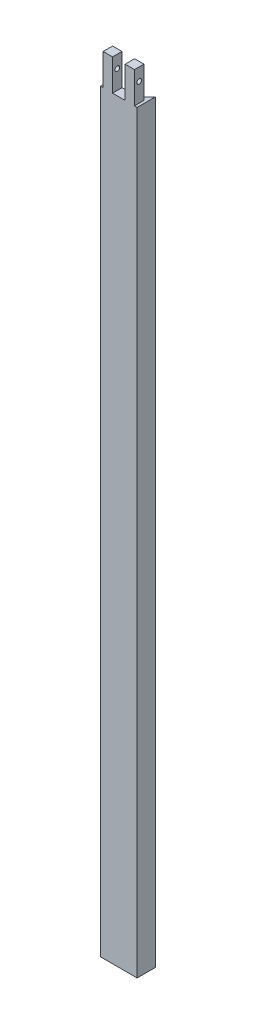
ISO-10303-21;
HEADER;
FILE_DESCRIPTION(('STEP AP214'),'2;1');
FILE_NAME('part.step','',(''),(''),'','','');
FILE_SCHEMA(('AUTOMOTIVE_DESIGN { 1 0 10303 214 1 1 1 1 }'));
ENDSEC;
DATA;
#1=APPLICATION_CONTEXT('core data for automotive mechanical design processes');
#2=APPLICATION_PROTOCOL_DEFINITION('international standard','automotive_design',2000,#1);
#3=PRODUCT_CONTEXT('',#1,'mechanical');
#4=PRODUCT('Part','Part','',(#3));
#5=PRODUCT_RELATED_PRODUCT_CATEGORY('part','',(#4));
#6=PRODUCT_DEFINITION_FORMATION('','',#4);
#7=PRODUCT_DEFINITION_CONTEXT('part definition',#1,'design');
#8=PRODUCT_DEFINITION('design','',#6,#7);
#9=PRODUCT_DEFINITION_SHAPE('','',#8);
#10=(LENGTH_UNIT() NAMED_UNIT(*) SI_UNIT(.MILLI.,.METRE.));
#11=(NAMED_UNIT(*) PLANE_ANGLE_UNIT() SI_UNIT($,.RADIAN.));
#12=(NAMED_UNIT(*) SI_UNIT($,.STERADIAN.) SOLID_ANGLE_UNIT());
#13=UNCERTAINTY_MEASURE_WITH_UNIT(LENGTH_MEASURE(1.E-05),#10,'distance_accuracy_value','');
#14=(GEOMETRIC_REPRESENTATION_CONTEXT(3) GLOBAL_UNCERTAINTY_ASSIGNED_CONTEXT((#13)) GLOBAL_UNIT_ASSIGNED_CONTEXT((#10,
#11,#12)) REPRESENTATION_CONTEXT('',''));
#15=CARTESIAN_POINT('',(0.,0.,0.));
#16=DIRECTION('',(0.,0.,1.));
#17=DIRECTION('',(1.,0.,0.));
#18=AXIS2_PLACEMENT_3D('',#15,#16,#17);
#19=CARTESIAN_POINT('',(0.,0.,3.));
#20=DIRECTION('',(0.,-1.,0.));
#21=DIRECTION('',(1.,0.,0.));
#22=AXIS2_PLACEMENT_3D('',#19,#20,#21);
#23=PLANE('',#22);
#24=DIRECTION('',(0.,0.,-1.));
#25=VECTOR('',#24,1.);
#26=CARTESIAN_POINT('',(2.00000000000002,0.,3.));
#27=LINE('',#26,#25);
#28=CARTESIAN_POINT('',(2.00000000000002,0.,3.));
#29=VERTEX_POINT('',#28);
#30=CARTESIAN_POINT('',(2.00000000000002,0.,0.));
#31=VERTEX_POINT('',#30);
#32=EDGE_CURVE('E168',#29,#31,#27,.T.);
#33=ORIENTED_EDGE('',*,*,#32,.F.);
#34=DIRECTION('',(-1.,0.,0.));
#35=VECTOR('',#34,1.);
#36=CARTESIAN_POINT('',(0.,0.,3.));
#37=LINE('',#36,#35);
#38=CARTESIAN_POINT('',(2.82842712474618,0.,3.));
#39=VERTEX_POINT('',#38);
#40=EDGE_CURVE('E260',#39,#29,#37,.T.);
#41=ORIENTED_EDGE('',*,*,#40,.F.);
#42=DIRECTION('',(0.,0.,1.));
#43=VECTOR('',#42,1.);
#44=CARTESIAN_POINT('',(2.82842712474619,0.,-2.82842712474619));
#45=LINE('',#44,#43);
#46=CARTESIAN_POINT('',(2.82842712474619,0.,-2.82842712474619));
#47=VERTEX_POINT('',#46);
#48=EDGE_CURVE('E241',#47,#39,#45,.T.);
#49=ORIENTED_EDGE('',*,*,#48,.F.);
#50=DIRECTION('',(0.707106781186546,0.,-0.707106781186549));
#51=VECTOR('',#50,1.);
#52=CARTESIAN_POINT('',(0.,0.,0.));
#53=LINE('',#52,#51);
#54=CARTESIAN_POINT('',(0.,0.,0.));
#55=VERTEX_POINT('',#54);
#56=EDGE_CURVE('E237',#55,#47,#53,.T.);
#57=ORIENTED_EDGE('',*,*,#56,.F.);
#58=DIRECTION('',(-1.,0.,0.));
#59=VECTOR('',#58,1.);
#60=CARTESIAN_POINT('',(2.00000000000002,0.,0.));
#61=LINE('',#60,#59);
#62=EDGE_CURVE('E56',#31,#55,#61,.T.);
#63=ORIENTED_EDGE('',*,*,#62,.F.);
#64=EDGE_LOOP('',(#33,#41,#49,#57,#63));
#65=FACE_BOUND('',#64,.T.);
#66=ADVANCED_FACE('F38',(#65),#23,.F.);
#67=DIRECTION('',(0.,0.,1.));
#68=VECTOR('',#67,1.);
#69=CARTESIAN_POINT('',(-0.999999999999984,0.,3.));
#70=LINE('',#69,#68);
#71=CARTESIAN_POINT('',(-0.999999999999984,0.,0.));
#72=VERTEX_POINT('',#71);
#73=CARTESIAN_POINT('',(-0.999999999999984,0.,3.));
#74=VERTEX_POINT('',#73);
#75=EDGE_CURVE('E165',#72,#74,#70,.T.);
#76=ORIENTED_EDGE('',*,*,#75,.F.);
#77=DIRECTION('',(-1.,0.,0.));
#78=VECTOR('',#77,1.);
#79=CARTESIAN_POINT('',(0.,0.,0.));
#80=LINE('',#79,#78);
#81=CARTESIAN_POINT('',(-4.99999999999998,0.,0.));
#82=VERTEX_POINT('',#81);
#83=EDGE_CURVE('E269',#72,#82,#80,.T.);
#84=ORIENTED_EDGE('',*,*,#83,.T.);
#85=DIRECTION('',(0.,0.,-1.));
#86=VECTOR('',#85,1.);
#87=CARTESIAN_POINT('',(-4.99999999999998,0.,3.));
#88=LINE('',#87,#86);
#89=CARTESIAN_POINT('',(-4.99999999999998,0.,3.));
#90=VERTEX_POINT('',#89);
#91=EDGE_CURVE('E175',#90,#82,#88,.T.);
#92=ORIENTED_EDGE('',*,*,#91,.F.);
#93=EDGE_CURVE('E64',#74,#90,#37,.T.);
#94=ORIENTED_EDGE('',*,*,#93,.F.);
#95=EDGE_LOOP('',(#76,#84,#92,#94));
#96=FACE_BOUND('',#95,.T.);
#97=ADVANCED_FACE('F289',(#96),#23,.F.);
#98=DIRECTION('',(0.,0.,1.));
#99=VECTOR('',#98,1.);
#100=CARTESIAN_POINT('',(-7.99999999999999,0.,3.));
#101=LINE('',#100,#99);
#102=CARTESIAN_POINT('',(-7.99999999999998,0.,0.));
#103=VERTEX_POINT('',#102);
#104=CARTESIAN_POINT('',(-7.99999999999999,0.,3.));
#105=VERTEX_POINT('',#104);
#106=EDGE_CURVE('E170',#103,#105,#101,.T.);
#107=ORIENTED_EDGE('',*,*,#106,.F.);
#108=DIRECTION('',(-1.,0.,0.));
#109=VECTOR('',#108,1.);
#110=CARTESIAN_POINT('',(-7.99999999999998,0.,0.));
#111=LINE('',#110,#109);
#112=CARTESIAN_POINT('',(-5.99999999999997,0.,0.));
#113=VERTEX_POINT('',#112);
#114=EDGE_CURVE('E11',#113,#103,#111,.T.);
#115=ORIENTED_EDGE('',*,*,#114,.F.);
#116=DIRECTION('',(0.707106781186546,0.,0.707106781186549));
#117=VECTOR('',#116,1.);
#118=CARTESIAN_POINT('',(-5.99999999999997,0.,0.));
#119=LINE('',#118,#117);
#120=CARTESIAN_POINT('',(-8.82842712474615,0.,-2.8284271247462));
#121=VERTEX_POINT('',#120);
#122=EDGE_CURVE('E218',#121,#113,#119,.T.);
#123=ORIENTED_EDGE('',*,*,#122,.F.);
#124=DIRECTION('',(0.,0.,-1.));
#125=VECTOR('',#124,1.);
#126=CARTESIAN_POINT('',(-8.82842712474615,0.,-2.8284271247462));
#127=LINE('',#126,#125);
#128=CARTESIAN_POINT('',(-8.82842712474615,0.,3.));
#129=VERTEX_POINT('',#128);
#130=EDGE_CURVE('E214',#129,#121,#127,.T.);
#131=ORIENTED_EDGE('',*,*,#130,.F.);
#132=EDGE_CURVE('E264',#105,#129,#37,.T.);
#133=ORIENTED_EDGE('',*,*,#132,.F.);
#134=EDGE_LOOP('',(#107,#115,#123,#131,#133));
#135=FACE_BOUND('',#134,.T.);
#136=ADVANCED_FACE('F40',(#135),#23,.F.);
#137=CARTESIAN_POINT('',(0.,-240.,3.));
#138=DIRECTION('',(0.,1.,0.));
#139=DIRECTION('',(0.,0.,1.));
#140=AXIS2_PLACEMENT_3D('',#137,#138,#139);
#141=PLANE('',#140);
#142=DIRECTION('',(1.,0.,0.));
#143=VECTOR('',#142,1.);
#144=CARTESIAN_POINT('',(0.,-240.,0.));
#145=LINE('',#144,#143);
#146=CARTESIAN_POINT('',(-5.99999999999997,-240.,0.));
#147=VERTEX_POINT('',#146);
#148=CARTESIAN_POINT('',(0.,-240.,0.));
#149=VERTEX_POINT('',#148);
#150=EDGE_CURVE('E275',#147,#149,#145,.T.);
#151=ORIENTED_EDGE('',*,*,#150,.T.);
#152=DIRECTION('',(0.707106781186546,0.,-0.707106781186549));
#153=VECTOR('',#152,1.);
#154=CARTESIAN_POINT('',(0.,-240.,0.));
#155=LINE('',#154,#153);
#156=CARTESIAN_POINT('',(2.82842712474619,-240.,-2.82842712474619));
#157=VERTEX_POINT('',#156);
#158=EDGE_CURVE('E234',#149,#157,#155,.T.);
#159=ORIENTED_EDGE('',*,*,#158,.T.);
#160=DIRECTION('',(0.,0.,1.));
#161=VECTOR('',#160,1.);
#162=CARTESIAN_POINT('',(2.82842712474619,-240.,-2.82842712474619));
#163=LINE('',#162,#161);
#164=CARTESIAN_POINT('',(2.82842712474618,-240.,3.));
#165=VERTEX_POINT('',#164);
#166=EDGE_CURVE('E242',#157,#165,#163,.T.);
#167=ORIENTED_EDGE('',*,*,#166,.T.);
#168=DIRECTION('',(1.,0.,0.));
#169=VECTOR('',#168,1.);
#170=CARTESIAN_POINT('',(0.,-240.,3.));
#171=LINE('',#170,#169);
#172=CARTESIAN_POINT('',(-8.82842712474615,-240.,3.));
#173=VERTEX_POINT('',#172);
#174=EDGE_CURVE('E48',#173,#165,#171,.T.);
#175=ORIENTED_EDGE('',*,*,#174,.F.);
#176=DIRECTION('',(0.,0.,-1.));
#177=VECTOR('',#176,1.);
#178=CARTESIAN_POINT('',(-8.82842712474615,-240.,-2.8284271247462));
#179=LINE('',#178,#177);
#180=CARTESIAN_POINT('',(-8.82842712474615,-240.,-2.8284271247462));
#181=VERTEX_POINT('',#180);
#182=EDGE_CURVE('E213',#173,#181,#179,.T.);
#183=ORIENTED_EDGE('',*,*,#182,.T.);
#184=DIRECTION('',(0.707106781186546,0.,0.707106781186549));
#185=VECTOR('',#184,1.);
#186=CARTESIAN_POINT('',(-5.99999999999997,-240.,0.));
#187=LINE('',#186,#185);
#188=EDGE_CURVE('E219',#181,#147,#187,.T.);
#189=ORIENTED_EDGE('',*,*,#188,.T.);
#190=EDGE_LOOP('',(#151,#159,#167,#175,#183,#189));
#191=FACE_BOUND('',#190,.T.);
#192=ADVANCED_FACE('F316',(#191),#141,.F.);
#193=CARTESIAN_POINT('',(0.,0.,3.));
#194=DIRECTION('',(0.,0.,-1.));
#195=DIRECTION('',(-1.,0.,0.));
#196=AXIS2_PLACEMENT_3D('',#193,#194,#195);
#197=PLANE('',#196);
#198=ORIENTED_EDGE('',*,*,#174,.T.);
#199=DIRECTION('',(0.,-1.,0.));
#200=VECTOR('',#199,1.);
#201=CARTESIAN_POINT('',(2.82842712474618,0.,3.));
#202=LINE('',#201,#200);
#203=EDGE_CURVE('E253',#39,#165,#202,.T.);
#204=ORIENTED_EDGE('',*,*,#203,.F.);
#205=ORIENTED_EDGE('',*,*,#40,.T.);
#206=DIRECTION('',(0.,-1.,0.));
#207=VECTOR('',#206,1.);
#208=CARTESIAN_POINT('',(2.00000000000002,10.,3.));
#209=LINE('',#208,#207);
#210=CARTESIAN_POINT('',(2.00000000000002,10.,3.));
#211=VERTEX_POINT('',#210);
#212=EDGE_CURVE('E319',#211,#29,#209,.T.);
#213=ORIENTED_EDGE('',*,*,#212,.F.);
#214=DIRECTION('',(1.,0.,0.));
#215=VECTOR('',#214,1.);
#216=CARTESIAN_POINT('',(2.00000000000002,10.,3.));
#217=LINE('',#216,#215);
#218=CARTESIAN_POINT('',(-0.999999999999986,10.,3.));
#219=VERTEX_POINT('',#218);
#220=EDGE_CURVE('E160',#219,#211,#217,.T.);
#221=ORIENTED_EDGE('',*,*,#220,.F.);
#222=DIRECTION('',(0.,-1.,0.));
#223=VECTOR('',#222,1.);
#224=CARTESIAN_POINT('',(-0.999999999999986,10.,3.));
#225=LINE('',#224,#223);
#226=EDGE_CURVE('E177',#219,#74,#225,.T.);
#227=ORIENTED_EDGE('',*,*,#226,.T.);
#228=ORIENTED_EDGE('',*,*,#93,.T.);
#229=DIRECTION('',(0.,-1.,0.));
#230=VECTOR('',#229,1.);
#231=CARTESIAN_POINT('',(-4.99999999999999,10.,3.));
#232=LINE('',#231,#230);
#233=CARTESIAN_POINT('',(-4.99999999999999,10.,3.));
#234=VERTEX_POINT('',#233);
#235=EDGE_CURVE('E205',#234,#90,#232,.T.);
#236=ORIENTED_EDGE('',*,*,#235,.F.);
#237=DIRECTION('',(1.,0.,0.));
#238=VECTOR('',#237,1.);
#239=CARTESIAN_POINT('',(-7.99999999999999,10.,3.));
#240=LINE('',#239,#238);
#241=CARTESIAN_POINT('',(-7.99999999999999,10.,3.));
#242=VERTEX_POINT('',#241);
#243=EDGE_CURVE('E185',#242,#234,#240,.T.);
#244=ORIENTED_EDGE('',*,*,#243,.F.);
#245=DIRECTION('',(0.,-1.,0.));
#246=VECTOR('',#245,1.);
#247=CARTESIAN_POINT('',(-7.99999999999999,10.,3.));
#248=LINE('',#247,#246);
#249=EDGE_CURVE('E209',#242,#105,#248,.T.);
#250=ORIENTED_EDGE('',*,*,#249,.T.);
#251=ORIENTED_EDGE('',*,*,#132,.T.);
#252=DIRECTION('',(0.,-1.,0.));
#253=VECTOR('',#252,1.);
#254=CARTESIAN_POINT('',(-8.82842712474615,0.,3.));
#255=LINE('',#254,#253);
#256=EDGE_CURVE('E230',#129,#173,#255,.T.);
#257=ORIENTED_EDGE('',*,*,#256,.T.);
#258=EDGE_LOOP('',(#198,#204,#205,#213,#221,#227,#228,#236,#244,#250,#251,#257));
#259=FACE_BOUND('',#258,.T.);
#260=ADVANCED_FACE('F286',(#259),#197,.F.);
#261=CARTESIAN_POINT('',(0.,0.,0.));
#262=DIRECTION('',(0.,0.,-1.));
#263=DIRECTION('',(-1.,0.,0.));
#264=AXIS2_PLACEMENT_3D('',#261,#262,#263);
#265=PLANE('',#264);
#266=DIRECTION('',(0.,1.,0.));
#267=VECTOR('',#266,1.);
#268=CARTESIAN_POINT('',(0.,0.,0.));
#269=LINE('',#268,#267);
#270=EDGE_CURVE('E257',#149,#55,#269,.T.);
#271=ORIENTED_EDGE('',*,*,#270,.F.);
#272=ORIENTED_EDGE('',*,*,#150,.F.);
#273=DIRECTION('',(0.,-1.,0.));
#274=VECTOR('',#273,1.);
#275=CARTESIAN_POINT('',(-6.,0.,0.));
#276=LINE('',#275,#274);
#277=EDGE_CURVE('E272',#113,#147,#276,.T.);
#278=ORIENTED_EDGE('',*,*,#277,.F.);
#279=ORIENTED_EDGE('',*,*,#114,.T.);
#280=DIRECTION('',(0.,-1.,0.));
#281=VECTOR('',#280,1.);
#282=CARTESIAN_POINT('',(-7.99999999999999,10.,0.));
#283=LINE('',#282,#281);
#284=CARTESIAN_POINT('',(-7.99999999999999,10.,0.));
#285=VERTEX_POINT('',#284);
#286=EDGE_CURVE('E193',#285,#103,#283,.T.);
#287=ORIENTED_EDGE('',*,*,#286,.F.);
#288=DIRECTION('',(-1.,0.,0.));
#289=VECTOR('',#288,1.);
#290=CARTESIAN_POINT('',(-7.99999999999999,10.,0.));
#291=LINE('',#290,#289);
#292=CARTESIAN_POINT('',(-4.99999999999999,10.,0.));
#293=VERTEX_POINT('',#292);
#294=EDGE_CURVE('E191',#293,#285,#291,.T.);
#295=ORIENTED_EDGE('',*,*,#294,.F.);
#296=DIRECTION('',(0.,-1.,0.));
#297=VECTOR('',#296,1.);
#298=CARTESIAN_POINT('',(-4.99999999999999,10.,0.));
#299=LINE('',#298,#297);
#300=EDGE_CURVE('E201',#293,#82,#299,.T.);
#301=ORIENTED_EDGE('',*,*,#300,.T.);
#302=ORIENTED_EDGE('',*,*,#83,.F.);
#303=DIRECTION('',(0.,-1.,0.));
#304=VECTOR('',#303,1.);
#305=CARTESIAN_POINT('',(-0.999999999999986,10.,0.));
#306=LINE('',#305,#304);
#307=CARTESIAN_POINT('',(-0.999999999999986,10.,0.));
#308=VERTEX_POINT('',#307);
#309=EDGE_CURVE('E150',#308,#72,#306,.T.);
#310=ORIENTED_EDGE('',*,*,#309,.F.);
#311=DIRECTION('',(-1.,0.,0.));
#312=VECTOR('',#311,1.);
#313=CARTESIAN_POINT('',(2.00000000000001,10.,0.));
#314=LINE('',#313,#312);
#315=CARTESIAN_POINT('',(2.00000000000001,10.,0.));
#316=VERTEX_POINT('',#315);
#317=EDGE_CURVE('E143',#316,#308,#314,.T.);
#318=ORIENTED_EDGE('',*,*,#317,.F.);
#319=DIRECTION('',(0.,-1.,0.));
#320=VECTOR('',#319,1.);
#321=CARTESIAN_POINT('',(2.00000000000001,10.,0.));
#322=LINE('',#321,#320);
#323=EDGE_CURVE('E147',#316,#31,#322,.T.);
#324=ORIENTED_EDGE('',*,*,#323,.T.);
#325=ORIENTED_EDGE('',*,*,#62,.T.);
#326=EDGE_LOOP('',(#271,#272,#278,#279,#287,#295,#301,#302,#310,#318,#324,#325));
#327=FACE_BOUND('',#326,.T.);
#328=ADVANCED_FACE('F145',(#327),#265,.T.);
#329=CARTESIAN_POINT('',(2.82842712474619,0.,-2.82842712474619));
#330=DIRECTION('',(1.,0.,0.));
#331=DIRECTION('',(0.,0.,-1.));
#332=AXIS2_PLACEMENT_3D('',#329,#330,#331);
#333=PLANE('',#332);
#334=ORIENTED_EDGE('',*,*,#166,.F.);
#335=DIRECTION('',(0.,-1.,0.));
#336=VECTOR('',#335,1.);
#337=CARTESIAN_POINT('',(2.82842712474619,0.,-2.82842712474619));
#338=LINE('',#337,#336);
#339=EDGE_CURVE('E246',#47,#157,#338,.T.);
#340=ORIENTED_EDGE('',*,*,#339,.F.);
#341=ORIENTED_EDGE('',*,*,#48,.T.);
#342=ORIENTED_EDGE('',*,*,#203,.T.);
#343=EDGE_LOOP('',(#334,#340,#341,#342));
#344=FACE_BOUND('',#343,.T.);
#345=ADVANCED_FACE('F314',(#344),#333,.T.);
#346=CARTESIAN_POINT('',(0.,0.,0.));
#347=DIRECTION('',(-0.707106781186549,0.,-0.707106781186546));
#348=DIRECTION('',(-0.707106781186546,0.,0.707106781186549));
#349=AXIS2_PLACEMENT_3D('',#346,#347,#348);
#350=PLANE('',#349);
#351=ORIENTED_EDGE('',*,*,#158,.F.);
#352=ORIENTED_EDGE('',*,*,#270,.T.);
#353=ORIENTED_EDGE('',*,*,#56,.T.);
#354=ORIENTED_EDGE('',*,*,#339,.T.);
#355=EDGE_LOOP('',(#351,#352,#353,#354));
#356=FACE_BOUND('',#355,.T.);
#357=ADVANCED_FACE('F318',(#356),#350,.T.);
#358=CARTESIAN_POINT('',(-8.82842712474615,0.,-2.8284271247462));
#359=DIRECTION('',(-1.,0.,0.));
#360=DIRECTION('',(0.,0.,1.));
#361=AXIS2_PLACEMENT_3D('',#358,#359,#360);
#362=PLANE('',#361);
#363=ORIENTED_EDGE('',*,*,#182,.F.);
#364=ORIENTED_EDGE('',*,*,#256,.F.);
#365=ORIENTED_EDGE('',*,*,#130,.T.);
#366=DIRECTION('',(0.,-1.,0.));
#367=VECTOR('',#366,1.);
#368=CARTESIAN_POINT('',(-8.82842712474615,0.,-2.8284271247462));
#369=LINE('',#368,#367);
#370=EDGE_CURVE('E223',#121,#181,#369,.T.);
#371=ORIENTED_EDGE('',*,*,#370,.T.);
#372=EDGE_LOOP('',(#363,#364,#365,#371));
#373=FACE_BOUND('',#372,.T.);
#374=ADVANCED_FACE('F310',(#373),#362,.T.);
#375=CARTESIAN_POINT('',(-5.99999999999997,0.,0.));
#376=DIRECTION('',(0.707106781186549,0.,-0.707106781186546));
#377=DIRECTION('',(-0.707106781186546,0.,-0.707106781186549));
#378=AXIS2_PLACEMENT_3D('',#375,#376,#377);
#379=PLANE('',#378);
#380=ORIENTED_EDGE('',*,*,#188,.F.);
#381=ORIENTED_EDGE('',*,*,#370,.F.);
#382=ORIENTED_EDGE('',*,*,#122,.T.);
#383=ORIENTED_EDGE('',*,*,#277,.T.);
#384=EDGE_LOOP('',(#380,#381,#382,#383));
#385=FACE_BOUND('',#384,.T.);
#386=ADVANCED_FACE('F307',(#385),#379,.T.);
#387=CARTESIAN_POINT('',(-7.99999999999999,10.,3.));
#388=DIRECTION('',(1.,0.,0.));
#389=DIRECTION('',(0.,0.,-1.));
#390=AXIS2_PLACEMENT_3D('',#387,#388,#389);
#391=PLANE('',#390);
#392=CARTESIAN_POINT('',(-7.99999999999999,6.,1.50000000000001));
#393=DIRECTION('',(1.,0.,0.));
#394=DIRECTION('',(0.,0.,-1.));
#395=AXIS2_PLACEMENT_3D('',#392,#393,#394);
#396=CIRCLE('',#395,0.75);
#397=CARTESIAN_POINT('',(-7.99999999999999,6.,0.750000000000006));
#398=VERTEX_POINT('',#397);
#399=EDGE_CURVE('E331',#398,#398,#396,.T.);
#400=ORIENTED_EDGE('',*,*,#399,.T.);
#401=EDGE_LOOP('',(#400));
#402=FACE_BOUND('',#401,.T.);
#403=ORIENTED_EDGE('',*,*,#106,.T.);
#404=ORIENTED_EDGE('',*,*,#249,.F.);
#405=DIRECTION('',(0.,0.,1.));
#406=VECTOR('',#405,1.);
#407=CARTESIAN_POINT('',(-7.99999999999999,10.,3.));
#408=LINE('',#407,#406);
#409=EDGE_CURVE('E181',#285,#242,#408,.T.);
#410=ORIENTED_EDGE('',*,*,#409,.F.);
#411=ORIENTED_EDGE('',*,*,#286,.T.);
#412=EDGE_LOOP('',(#403,#404,#410,#411));
#413=FACE_BOUND('',#412,.T.);
#414=ADVANCED_FACE('F300',(#402,#413),#391,.F.);
#415=CARTESIAN_POINT('',(-4.99999999999999,10.,3.));
#416=DIRECTION('',(-1.,0.,0.));
#417=DIRECTION('',(0.,-1.,0.));
#418=AXIS2_PLACEMENT_3D('',#415,#416,#417);
#419=PLANE('',#418);
#420=CARTESIAN_POINT('',(-4.99999999999998,6.,1.5));
#421=DIRECTION('',(-1.,0.,0.));
#422=DIRECTION('',(0.,-1.,0.));
#423=AXIS2_PLACEMENT_3D('',#420,#421,#422);
#424=CIRCLE('',#423,0.75);
#425=CARTESIAN_POINT('',(-4.99999999999998,5.25,1.5));
#426=VERTEX_POINT('',#425);
#427=EDGE_CURVE('E338',#426,#426,#424,.T.);
#428=ORIENTED_EDGE('',*,*,#427,.T.);
#429=EDGE_LOOP('',(#428));
#430=FACE_BOUND('',#429,.T.);
#431=ORIENTED_EDGE('',*,*,#91,.T.);
#432=ORIENTED_EDGE('',*,*,#300,.F.);
#433=DIRECTION('',(0.,0.,-1.));
#434=VECTOR('',#433,1.);
#435=CARTESIAN_POINT('',(-4.99999999999999,10.,3.));
#436=LINE('',#435,#434);
#437=EDGE_CURVE('E188',#234,#293,#436,.T.);
#438=ORIENTED_EDGE('',*,*,#437,.F.);
#439=ORIENTED_EDGE('',*,*,#235,.T.);
#440=EDGE_LOOP('',(#431,#432,#438,#439));
#441=FACE_BOUND('',#440,.T.);
#442=ADVANCED_FACE('F292',(#430,#441),#419,.F.);
#443=CARTESIAN_POINT('',(0.,10.,0.));
#444=DIRECTION('',(0.,-1.,0.));
#445=DIRECTION('',(1.,0.,0.));
#446=AXIS2_PLACEMENT_3D('',#443,#444,#445);
#447=PLANE('',#446);
#448=ORIENTED_EDGE('',*,*,#409,.T.);
#449=ORIENTED_EDGE('',*,*,#243,.T.);
#450=ORIENTED_EDGE('',*,*,#437,.T.);
#451=ORIENTED_EDGE('',*,*,#294,.T.);
#452=EDGE_LOOP('',(#448,#449,#450,#451));
#453=FACE_BOUND('',#452,.T.);
#454=ADVANCED_FACE('F295',(#453),#447,.F.);
#455=CARTESIAN_POINT('',(2.00000000000002,10.,3.));
#456=DIRECTION('',(-1.,0.,0.));
#457=DIRECTION('',(0.,0.,1.));
#458=AXIS2_PLACEMENT_3D('',#455,#456,#457);
#459=PLANE('',#458);
#460=CARTESIAN_POINT('',(2.00000000000002,6.,1.5));
#461=DIRECTION('',(1.,0.,0.));
#462=DIRECTION('',(0.,0.,-1.));
#463=AXIS2_PLACEMENT_3D('',#460,#461,#462);
#464=CIRCLE('',#463,0.75);
#465=CARTESIAN_POINT('',(2.00000000000002,6.,0.75));
#466=VERTEX_POINT('',#465);
#467=EDGE_CURVE('E342',#466,#466,#464,.T.);
#468=ORIENTED_EDGE('',*,*,#467,.F.);
#469=EDGE_LOOP('',(#468));
#470=FACE_BOUND('',#469,.T.);
#471=ORIENTED_EDGE('',*,*,#32,.T.);
#472=ORIENTED_EDGE('',*,*,#323,.F.);
#473=DIRECTION('',(0.,0.,-1.));
#474=VECTOR('',#473,1.);
#475=CARTESIAN_POINT('',(2.00000000000002,10.,3.));
#476=LINE('',#475,#474);
#477=EDGE_CURVE('E155',#211,#316,#476,.T.);
#478=ORIENTED_EDGE('',*,*,#477,.F.);
#479=ORIENTED_EDGE('',*,*,#212,.T.);
#480=EDGE_LOOP('',(#471,#472,#478,#479));
#481=FACE_BOUND('',#480,.T.);
#482=ADVANCED_FACE('F167',(#470,#481),#459,.F.);
#483=CARTESIAN_POINT('',(-0.999999999999986,10.,3.));
#484=DIRECTION('',(1.,0.,0.));
#485=DIRECTION('',(0.,1.,0.));
#486=AXIS2_PLACEMENT_3D('',#483,#484,#485);
#487=PLANE('',#486);
#488=CARTESIAN_POINT('',(-0.999999999999987,6.,1.5));
#489=DIRECTION('',(1.,0.,0.));
#490=DIRECTION('',(0.,1.,0.));
#491=AXIS2_PLACEMENT_3D('',#488,#489,#490);
#492=CIRCLE('',#491,0.75);
#493=CARTESIAN_POINT('',(-0.999999999999987,6.75,1.5));
#494=VERTEX_POINT('',#493);
#495=EDGE_CURVE('E42',#494,#494,#492,.T.);
#496=ORIENTED_EDGE('',*,*,#495,.T.);
#497=EDGE_LOOP('',(#496));
#498=FACE_BOUND('',#497,.T.);
#499=ORIENTED_EDGE('',*,*,#75,.T.);
#500=ORIENTED_EDGE('',*,*,#226,.F.);
#501=DIRECTION('',(0.,0.,1.));
#502=VECTOR('',#501,1.);
#503=CARTESIAN_POINT('',(-0.999999999999986,10.,3.));
#504=LINE('',#503,#502);
#505=EDGE_CURVE('E154',#308,#219,#504,.T.);
#506=ORIENTED_EDGE('',*,*,#505,.F.);
#507=ORIENTED_EDGE('',*,*,#309,.T.);
#508=EDGE_LOOP('',(#499,#500,#506,#507));
#509=FACE_BOUND('',#508,.T.);
#510=ADVANCED_FACE('F351',(#498,#509),#487,.F.);
#511=CARTESIAN_POINT('',(0.,10.,0.));
#512=DIRECTION('',(0.,1.,0.));
#513=DIRECTION('',(-1.,0.,0.));
#514=AXIS2_PLACEMENT_3D('',#511,#512,#513);
#515=PLANE('',#514);
#516=ORIENTED_EDGE('',*,*,#477,.T.);
#517=ORIENTED_EDGE('',*,*,#317,.T.);
#518=ORIENTED_EDGE('',*,*,#505,.T.);
#519=ORIENTED_EDGE('',*,*,#220,.T.);
#520=EDGE_LOOP('',(#516,#517,#518,#519));
#521=FACE_BOUND('',#520,.T.);
#522=ADVANCED_FACE('F158',(#521),#515,.T.);
#523=CARTESIAN_POINT('',(-38.,5.99999999999999,1.50000000000002));
#524=DIRECTION('',(1.,0.,0.));
#525=DIRECTION('',(0.,0.,-1.));
#526=AXIS2_PLACEMENT_3D('',#523,#524,#525);
#527=CYLINDRICAL_SURFACE('',#526,0.75);
#528=ORIENTED_EDGE('',*,*,#467,.T.);
#529=EDGE_LOOP('',(#528));
#530=FACE_BOUND('',#529,.T.);
#531=ORIENTED_EDGE('',*,*,#495,.F.);
#532=EDGE_LOOP('',(#531));
#533=FACE_BOUND('',#532,.T.);
#534=ADVANCED_FACE('F354',(#530,#533),#527,.F.);
#535=ORIENTED_EDGE('',*,*,#427,.F.);
#536=EDGE_LOOP('',(#535));
#537=FACE_BOUND('',#536,.T.);
#538=ORIENTED_EDGE('',*,*,#399,.F.);
#539=EDGE_LOOP('',(#538));
#540=FACE_BOUND('',#539,.T.);
#541=ADVANCED_FACE('F356',(#537,#540),#527,.F.);
#542=CLOSED_SHELL('',(#66,#97,#136,#192,#260,#328,#345,#357,#374,#386,#414,#442,#454,#482,#510,
#522,#534,#541));
#543=MANIFOLD_SOLID_BREP('B2',#542);
#544=ADVANCED_BREP_SHAPE_REPRESENTATION('',(#18,#543),#14);
#545=SHAPE_DEFINITION_REPRESENTATION(#9,#544);
ENDSEC;
END-ISO-10303-21;
